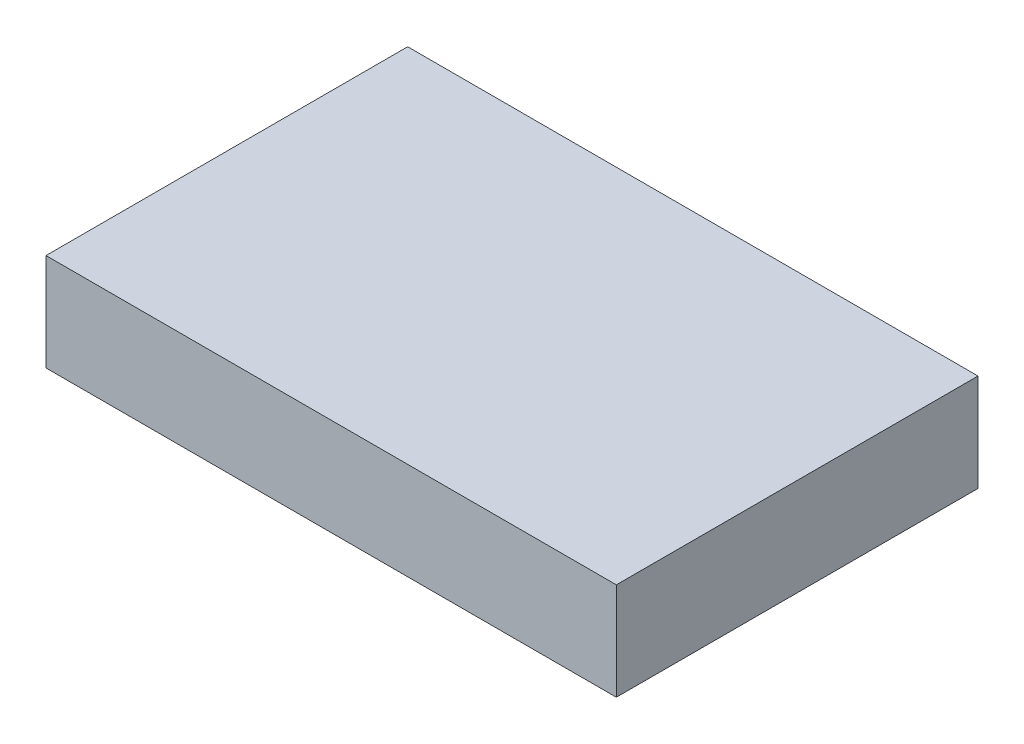
ISO-10303-21;
HEADER;
FILE_DESCRIPTION(('STEP AP214'),'2;1');
FILE_NAME('part.step','',(''),(''),'','','');
FILE_SCHEMA(('AUTOMOTIVE_DESIGN { 1 0 10303 214 1 1 1 1 }'));
ENDSEC;
DATA;
#1=APPLICATION_CONTEXT('core data for automotive mechanical design processes');
#2=APPLICATION_PROTOCOL_DEFINITION('international standard','automotive_design',2000,#1);
#3=PRODUCT_CONTEXT('',#1,'mechanical');
#4=PRODUCT('Part','Part','',(#3));
#5=PRODUCT_RELATED_PRODUCT_CATEGORY('part','',(#4));
#6=PRODUCT_DEFINITION_FORMATION('','',#4);
#7=PRODUCT_DEFINITION_CONTEXT('part definition',#1,'design');
#8=PRODUCT_DEFINITION('design','',#6,#7);
#9=PRODUCT_DEFINITION_SHAPE('','',#8);
#10=(LENGTH_UNIT() NAMED_UNIT(*) SI_UNIT(.MILLI.,.METRE.));
#11=(NAMED_UNIT(*) PLANE_ANGLE_UNIT() SI_UNIT($,.RADIAN.));
#12=(NAMED_UNIT(*) SI_UNIT($,.STERADIAN.) SOLID_ANGLE_UNIT());
#13=UNCERTAINTY_MEASURE_WITH_UNIT(LENGTH_MEASURE(1.E-05),#10,'distance_accuracy_value','');
#14=(GEOMETRIC_REPRESENTATION_CONTEXT(3) GLOBAL_UNCERTAINTY_ASSIGNED_CONTEXT((#13)) GLOBAL_UNIT_ASSIGNED_CONTEXT((#10,
#11,#12)) REPRESENTATION_CONTEXT('',''));
#15=CARTESIAN_POINT('',(0.,0.,0.));
#16=DIRECTION('',(0.,0.,1.));
#17=DIRECTION('',(1.,0.,0.));
#18=AXIS2_PLACEMENT_3D('',#15,#16,#17);
#19=CARTESIAN_POINT('',(-82.,-14.,-52.));
#20=DIRECTION('',(-1.,0.,0.));
#21=DIRECTION('',(0.,0.,1.));
#22=AXIS2_PLACEMENT_3D('',#19,#20,#21);
#23=PLANE('',#22);
#24=DIRECTION('',(0.,1.,0.));
#25=VECTOR('',#24,1.);
#26=CARTESIAN_POINT('',(-82.,-14.,52.));
#27=LINE('',#26,#25);
#28=CARTESIAN_POINT('',(-82.,-14.,52.));
#29=VERTEX_POINT('',#28);
#30=CARTESIAN_POINT('',(-82.,14.,52.));
#31=VERTEX_POINT('',#30);
#32=EDGE_CURVE('E36',#29,#31,#27,.T.);
#33=ORIENTED_EDGE('',*,*,#32,.T.);
#34=DIRECTION('',(0.,0.,1.));
#35=VECTOR('',#34,1.);
#36=CARTESIAN_POINT('',(-82.,14.,-52.));
#37=LINE('',#36,#35);
#38=CARTESIAN_POINT('',(-82.,14.,-52.));
#39=VERTEX_POINT('',#38);
#40=EDGE_CURVE('E73',#39,#31,#37,.T.);
#41=ORIENTED_EDGE('',*,*,#40,.F.);
#42=DIRECTION('',(0.,1.,0.));
#43=VECTOR('',#42,1.);
#44=CARTESIAN_POINT('',(-82.,-14.,-52.));
#45=LINE('',#44,#43);
#46=CARTESIAN_POINT('',(-82.,-14.,-52.));
#47=VERTEX_POINT('',#46);
#48=EDGE_CURVE('E11',#47,#39,#45,.T.);
#49=ORIENTED_EDGE('',*,*,#48,.F.);
#50=DIRECTION('',(0.,0.,1.));
#51=VECTOR('',#50,1.);
#52=CARTESIAN_POINT('',(-82.,-14.,-52.));
#53=LINE('',#52,#51);
#54=EDGE_CURVE('E74',#47,#29,#53,.T.);
#55=ORIENTED_EDGE('',*,*,#54,.T.);
#56=EDGE_LOOP('',(#33,#41,#49,#55));
#57=FACE_BOUND('',#56,.T.);
#58=ADVANCED_FACE('F33',(#57),#23,.T.);
#59=CARTESIAN_POINT('',(-82.,-14.,-52.));
#60=DIRECTION('',(0.,0.,-1.));
#61=DIRECTION('',(-1.,0.,0.));
#62=AXIS2_PLACEMENT_3D('',#59,#60,#61);
#63=PLANE('',#62);
#64=ORIENTED_EDGE('',*,*,#48,.T.);
#65=DIRECTION('',(-1.,0.,0.));
#66=VECTOR('',#65,1.);
#67=CARTESIAN_POINT('',(-82.,14.,-52.));
#68=LINE('',#67,#66);
#69=CARTESIAN_POINT('',(82.,14.,-52.));
#70=VERTEX_POINT('',#69);
#71=EDGE_CURVE('E90',#70,#39,#68,.T.);
#72=ORIENTED_EDGE('',*,*,#71,.F.);
#73=DIRECTION('',(0.,1.,0.));
#74=VECTOR('',#73,1.);
#75=CARTESIAN_POINT('',(82.,-14.,-52.));
#76=LINE('',#75,#74);
#77=CARTESIAN_POINT('',(82.,-14.,-52.));
#78=VERTEX_POINT('',#77);
#79=EDGE_CURVE('E41',#78,#70,#76,.T.);
#80=ORIENTED_EDGE('',*,*,#79,.F.);
#81=DIRECTION('',(-1.,0.,0.));
#82=VECTOR('',#81,1.);
#83=CARTESIAN_POINT('',(-82.,-14.,-52.));
#84=LINE('',#83,#82);
#85=EDGE_CURVE('E79',#78,#47,#84,.T.);
#86=ORIENTED_EDGE('',*,*,#85,.T.);
#87=EDGE_LOOP('',(#64,#72,#80,#86));
#88=FACE_BOUND('',#87,.T.);
#89=ADVANCED_FACE('F105',(#88),#63,.T.);
#90=CARTESIAN_POINT('',(82.,-14.,-52.));
#91=DIRECTION('',(1.,0.,0.));
#92=DIRECTION('',(0.,0.,-1.));
#93=AXIS2_PLACEMENT_3D('',#90,#91,#92);
#94=PLANE('',#93);
#95=ORIENTED_EDGE('',*,*,#79,.T.);
#96=DIRECTION('',(0.,0.,-1.));
#97=VECTOR('',#96,1.);
#98=CARTESIAN_POINT('',(82.,14.,-52.));
#99=LINE('',#98,#97);
#100=CARTESIAN_POINT('',(82.,14.,52.));
#101=VERTEX_POINT('',#100);
#102=EDGE_CURVE('E86',#101,#70,#99,.T.);
#103=ORIENTED_EDGE('',*,*,#102,.F.);
#104=DIRECTION('',(0.,1.,0.));
#105=VECTOR('',#104,1.);
#106=CARTESIAN_POINT('',(82.,-14.,52.));
#107=LINE('',#106,#105);
#108=CARTESIAN_POINT('',(82.,-14.,52.));
#109=VERTEX_POINT('',#108);
#110=EDGE_CURVE('E78',#109,#101,#107,.T.);
#111=ORIENTED_EDGE('',*,*,#110,.F.);
#112=DIRECTION('',(0.,0.,-1.));
#113=VECTOR('',#112,1.);
#114=CARTESIAN_POINT('',(82.,-14.,-52.));
#115=LINE('',#114,#113);
#116=EDGE_CURVE('E98',#109,#78,#115,.T.);
#117=ORIENTED_EDGE('',*,*,#116,.T.);
#118=EDGE_LOOP('',(#95,#103,#111,#117));
#119=FACE_BOUND('',#118,.T.);
#120=ADVANCED_FACE('F102',(#119),#94,.T.);
#121=CARTESIAN_POINT('',(-82.,-14.,52.));
#122=DIRECTION('',(0.,0.,1.));
#123=DIRECTION('',(1.,0.,0.));
#124=AXIS2_PLACEMENT_3D('',#121,#122,#123);
#125=PLANE('',#124);
#126=ORIENTED_EDGE('',*,*,#110,.T.);
#127=DIRECTION('',(1.,0.,0.));
#128=VECTOR('',#127,1.);
#129=CARTESIAN_POINT('',(-82.,14.,52.));
#130=LINE('',#129,#128);
#131=EDGE_CURVE('E81',#31,#101,#130,.T.);
#132=ORIENTED_EDGE('',*,*,#131,.F.);
#133=ORIENTED_EDGE('',*,*,#32,.F.);
#134=DIRECTION('',(1.,0.,0.));
#135=VECTOR('',#134,1.);
#136=CARTESIAN_POINT('',(-82.,-14.,52.));
#137=LINE('',#136,#135);
#138=EDGE_CURVE('E96',#29,#109,#137,.T.);
#139=ORIENTED_EDGE('',*,*,#138,.T.);
#140=EDGE_LOOP('',(#126,#132,#133,#139));
#141=FACE_BOUND('',#140,.T.);
#142=ADVANCED_FACE('F82',(#141),#125,.T.);
#143=CARTESIAN_POINT('',(0.,-14.,0.));
#144=DIRECTION('',(0.,1.,0.));
#145=DIRECTION('',(0.,0.,1.));
#146=AXIS2_PLACEMENT_3D('',#143,#144,#145);
#147=PLANE('',#146);
#148=ORIENTED_EDGE('',*,*,#54,.F.);
#149=ORIENTED_EDGE('',*,*,#85,.F.);
#150=ORIENTED_EDGE('',*,*,#116,.F.);
#151=ORIENTED_EDGE('',*,*,#138,.F.);
#152=EDGE_LOOP('',(#148,#149,#150,#151));
#153=FACE_BOUND('',#152,.T.);
#154=ADVANCED_FACE('F107',(#153),#147,.F.);
#155=CARTESIAN_POINT('',(0.,14.,0.));
#156=DIRECTION('',(0.,1.,0.));
#157=DIRECTION('',(0.,0.,1.));
#158=AXIS2_PLACEMENT_3D('',#155,#156,#157);
#159=PLANE('',#158);
#160=ORIENTED_EDGE('',*,*,#40,.T.);
#161=ORIENTED_EDGE('',*,*,#131,.T.);
#162=ORIENTED_EDGE('',*,*,#102,.T.);
#163=ORIENTED_EDGE('',*,*,#71,.T.);
#164=EDGE_LOOP('',(#160,#161,#162,#163));
#165=FACE_BOUND('',#164,.T.);
#166=ADVANCED_FACE('F89',(#165),#159,.T.);
#167=CLOSED_SHELL('',(#58,#89,#120,#142,#154,#166));
#168=MANIFOLD_SOLID_BREP('B2',#167);
#169=ADVANCED_BREP_SHAPE_REPRESENTATION('',(#18,#168),#14);
#170=SHAPE_DEFINITION_REPRESENTATION(#9,#169);
ENDSEC;
END-ISO-10303-21;
